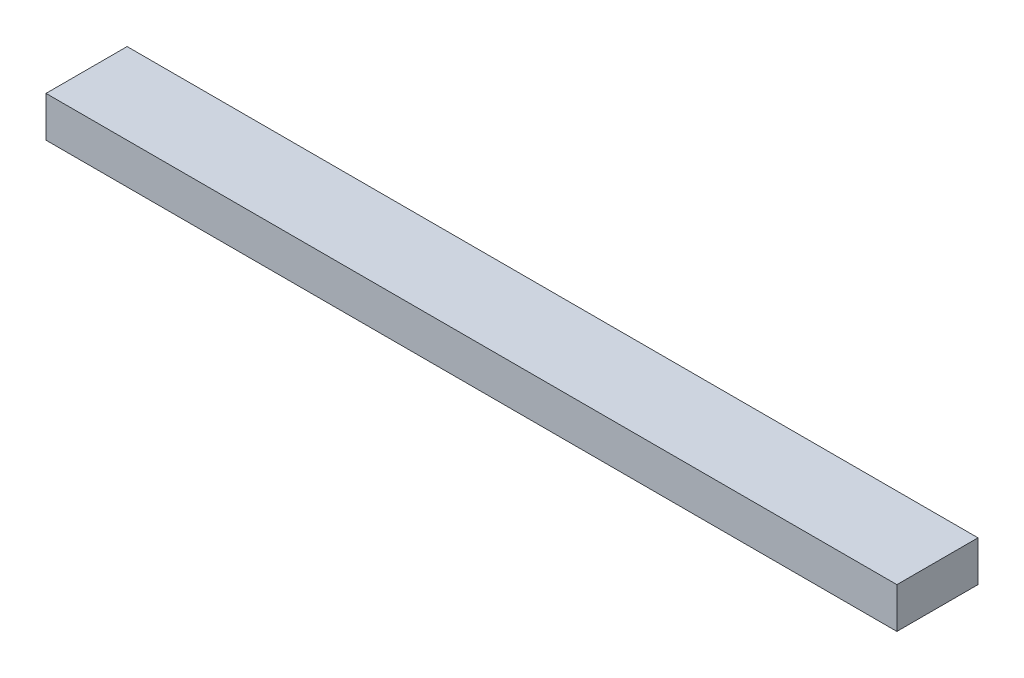
ISO-10303-21;
HEADER;
FILE_DESCRIPTION(('STEP AP214'),'2;1');
FILE_NAME('part.step','',(''),(''),'','','');
FILE_SCHEMA(('AUTOMOTIVE_DESIGN { 1 0 10303 214 1 1 1 1 }'));
ENDSEC;
DATA;
#1=APPLICATION_CONTEXT('core data for automotive mechanical design processes');
#2=APPLICATION_PROTOCOL_DEFINITION('international standard','automotive_design',2000,#1);
#3=PRODUCT_CONTEXT('',#1,'mechanical');
#4=PRODUCT('Part','Part','',(#3));
#5=PRODUCT_RELATED_PRODUCT_CATEGORY('part','',(#4));
#6=PRODUCT_DEFINITION_FORMATION('','',#4);
#7=PRODUCT_DEFINITION_CONTEXT('part definition',#1,'design');
#8=PRODUCT_DEFINITION('design','',#6,#7);
#9=PRODUCT_DEFINITION_SHAPE('','',#8);
#10=(LENGTH_UNIT() NAMED_UNIT(*) SI_UNIT(.MILLI.,.METRE.));
#11=(NAMED_UNIT(*) PLANE_ANGLE_UNIT() SI_UNIT($,.RADIAN.));
#12=(NAMED_UNIT(*) SI_UNIT($,.STERADIAN.) SOLID_ANGLE_UNIT());
#13=UNCERTAINTY_MEASURE_WITH_UNIT(LENGTH_MEASURE(1.E-05),#10,'distance_accuracy_value','');
#14=(GEOMETRIC_REPRESENTATION_CONTEXT(3) GLOBAL_UNCERTAINTY_ASSIGNED_CONTEXT((#13)) GLOBAL_UNIT_ASSIGNED_CONTEXT((#10,
#11,#12)) REPRESENTATION_CONTEXT('',''));
#15=CARTESIAN_POINT('',(0.,0.,0.));
#16=DIRECTION('',(0.,0.,1.));
#17=DIRECTION('',(1.,0.,0.));
#18=AXIS2_PLACEMENT_3D('',#15,#16,#17);
#19=CARTESIAN_POINT('',(0.,5.,10.));
#20=DIRECTION('',(1.,0.,0.));
#21=DIRECTION('',(0.,0.,-1.));
#22=AXIS2_PLACEMENT_3D('',#19,#20,#21);
#23=PLANE('',#22);
#24=DIRECTION('',(0.,0.,1.));
#25=VECTOR('',#24,1.);
#26=CARTESIAN_POINT('',(0.,0.,10.));
#27=LINE('',#26,#25);
#28=CARTESIAN_POINT('',(0.,0.,0.));
#29=VERTEX_POINT('',#28);
#30=CARTESIAN_POINT('',(0.,0.,10.));
#31=VERTEX_POINT('',#30);
#32=EDGE_CURVE('E98',#29,#31,#27,.T.);
#33=ORIENTED_EDGE('',*,*,#32,.T.);
#34=DIRECTION('',(0.,-1.,0.));
#35=VECTOR('',#34,1.);
#36=CARTESIAN_POINT('',(0.,5.,10.));
#37=LINE('',#36,#35);
#38=CARTESIAN_POINT('',(0.,5.,10.));
#39=VERTEX_POINT('',#38);
#40=EDGE_CURVE('E11',#39,#31,#37,.T.);
#41=ORIENTED_EDGE('',*,*,#40,.F.);
#42=DIRECTION('',(0.,0.,1.));
#43=VECTOR('',#42,1.);
#44=CARTESIAN_POINT('',(0.,5.,10.));
#45=LINE('',#44,#43);
#46=CARTESIAN_POINT('',(0.,5.,0.));
#47=VERTEX_POINT('',#46);
#48=EDGE_CURVE('E86',#47,#39,#45,.T.);
#49=ORIENTED_EDGE('',*,*,#48,.F.);
#50=DIRECTION('',(0.,-1.,0.));
#51=VECTOR('',#50,1.);
#52=CARTESIAN_POINT('',(0.,5.,0.));
#53=LINE('',#52,#51);
#54=EDGE_CURVE('E94',#47,#29,#53,.T.);
#55=ORIENTED_EDGE('',*,*,#54,.T.);
#56=EDGE_LOOP('',(#33,#41,#49,#55));
#57=FACE_BOUND('',#56,.T.);
#58=ADVANCED_FACE('F35',(#57),#23,.F.);
#59=CARTESIAN_POINT('',(104.91,5.,10.));
#60=DIRECTION('',(0.,0.,-1.));
#61=DIRECTION('',(-1.,0.,0.));
#62=AXIS2_PLACEMENT_3D('',#59,#60,#61);
#63=PLANE('',#62);
#64=DIRECTION('',(1.,0.,0.));
#65=VECTOR('',#64,1.);
#66=CARTESIAN_POINT('',(104.91,0.,10.));
#67=LINE('',#66,#65);
#68=CARTESIAN_POINT('',(104.91,0.,10.));
#69=VERTEX_POINT('',#68);
#70=EDGE_CURVE('E90',#31,#69,#67,.T.);
#71=ORIENTED_EDGE('',*,*,#70,.T.);
#72=DIRECTION('',(0.,-1.,0.));
#73=VECTOR('',#72,1.);
#74=CARTESIAN_POINT('',(104.91,5.,10.));
#75=LINE('',#74,#73);
#76=CARTESIAN_POINT('',(104.91,5.,10.));
#77=VERTEX_POINT('',#76);
#78=EDGE_CURVE('E43',#77,#69,#75,.T.);
#79=ORIENTED_EDGE('',*,*,#78,.F.);
#80=DIRECTION('',(1.,0.,0.));
#81=VECTOR('',#80,1.);
#82=CARTESIAN_POINT('',(104.91,5.,10.));
#83=LINE('',#82,#81);
#84=EDGE_CURVE('E81',#39,#77,#83,.T.);
#85=ORIENTED_EDGE('',*,*,#84,.F.);
#86=ORIENTED_EDGE('',*,*,#40,.T.);
#87=EDGE_LOOP('',(#71,#79,#85,#86));
#88=FACE_BOUND('',#87,.T.);
#89=ADVANCED_FACE('F89',(#88),#63,.F.);
#90=CARTESIAN_POINT('',(104.91,5.,0.));
#91=DIRECTION('',(-1.,0.,0.));
#92=DIRECTION('',(0.,0.,1.));
#93=AXIS2_PLACEMENT_3D('',#90,#91,#92);
#94=PLANE('',#93);
#95=DIRECTION('',(0.,0.,-1.));
#96=VECTOR('',#95,1.);
#97=CARTESIAN_POINT('',(104.91,0.,0.));
#98=LINE('',#97,#96);
#99=CARTESIAN_POINT('',(104.91,0.,0.));
#100=VERTEX_POINT('',#99);
#101=EDGE_CURVE('E68',#69,#100,#98,.T.);
#102=ORIENTED_EDGE('',*,*,#101,.T.);
#103=DIRECTION('',(0.,-1.,0.));
#104=VECTOR('',#103,1.);
#105=CARTESIAN_POINT('',(104.91,5.,0.));
#106=LINE('',#105,#104);
#107=CARTESIAN_POINT('',(104.91,5.,0.));
#108=VERTEX_POINT('',#107);
#109=EDGE_CURVE('E91',#108,#100,#106,.T.);
#110=ORIENTED_EDGE('',*,*,#109,.F.);
#111=DIRECTION('',(0.,0.,-1.));
#112=VECTOR('',#111,1.);
#113=CARTESIAN_POINT('',(104.91,5.,0.));
#114=LINE('',#113,#112);
#115=EDGE_CURVE('E84',#77,#108,#114,.T.);
#116=ORIENTED_EDGE('',*,*,#115,.F.);
#117=ORIENTED_EDGE('',*,*,#78,.T.);
#118=EDGE_LOOP('',(#102,#110,#116,#117));
#119=FACE_BOUND('',#118,.T.);
#120=ADVANCED_FACE('F92',(#119),#94,.F.);
#121=CARTESIAN_POINT('',(0.,5.,0.));
#122=DIRECTION('',(0.,0.,1.));
#123=DIRECTION('',(1.,0.,0.));
#124=AXIS2_PLACEMENT_3D('',#121,#122,#123);
#125=PLANE('',#124);
#126=DIRECTION('',(-1.,0.,0.));
#127=VECTOR('',#126,1.);
#128=CARTESIAN_POINT('',(0.,0.,0.));
#129=LINE('',#128,#127);
#130=EDGE_CURVE('E74',#100,#29,#129,.T.);
#131=ORIENTED_EDGE('',*,*,#130,.T.);
#132=ORIENTED_EDGE('',*,*,#54,.F.);
#133=DIRECTION('',(-1.,0.,0.));
#134=VECTOR('',#133,1.);
#135=CARTESIAN_POINT('',(0.,5.,0.));
#136=LINE('',#135,#134);
#137=EDGE_CURVE('E51',#108,#47,#136,.T.);
#138=ORIENTED_EDGE('',*,*,#137,.F.);
#139=ORIENTED_EDGE('',*,*,#109,.T.);
#140=EDGE_LOOP('',(#131,#132,#138,#139));
#141=FACE_BOUND('',#140,.T.);
#142=ADVANCED_FACE('F105',(#141),#125,.F.);
#143=CARTESIAN_POINT('',(0.,5.,0.));
#144=DIRECTION('',(0.,-1.,0.));
#145=DIRECTION('',(0.,0.,-1.));
#146=AXIS2_PLACEMENT_3D('',#143,#144,#145);
#147=PLANE('',#146);
#148=ORIENTED_EDGE('',*,*,#48,.T.);
#149=ORIENTED_EDGE('',*,*,#84,.T.);
#150=ORIENTED_EDGE('',*,*,#115,.T.);
#151=ORIENTED_EDGE('',*,*,#137,.T.);
#152=EDGE_LOOP('',(#148,#149,#150,#151));
#153=FACE_BOUND('',#152,.T.);
#154=ADVANCED_FACE('F82',(#153),#147,.F.);
#155=CARTESIAN_POINT('',(0.,0.,0.));
#156=DIRECTION('',(0.,-1.,0.));
#157=DIRECTION('',(0.,0.,-1.));
#158=AXIS2_PLACEMENT_3D('',#155,#156,#157);
#159=PLANE('',#158);
#160=ORIENTED_EDGE('',*,*,#32,.F.);
#161=ORIENTED_EDGE('',*,*,#130,.F.);
#162=ORIENTED_EDGE('',*,*,#101,.F.);
#163=ORIENTED_EDGE('',*,*,#70,.F.);
#164=EDGE_LOOP('',(#160,#161,#162,#163));
#165=FACE_BOUND('',#164,.T.);
#166=ADVANCED_FACE('F108',(#165),#159,.T.);
#167=CLOSED_SHELL('',(#58,#89,#120,#142,#154,#166));
#168=MANIFOLD_SOLID_BREP('B2',#167);
#169=ADVANCED_BREP_SHAPE_REPRESENTATION('',(#18,#168),#14);
#170=SHAPE_DEFINITION_REPRESENTATION(#9,#169);
ENDSEC;
END-ISO-10303-21;
